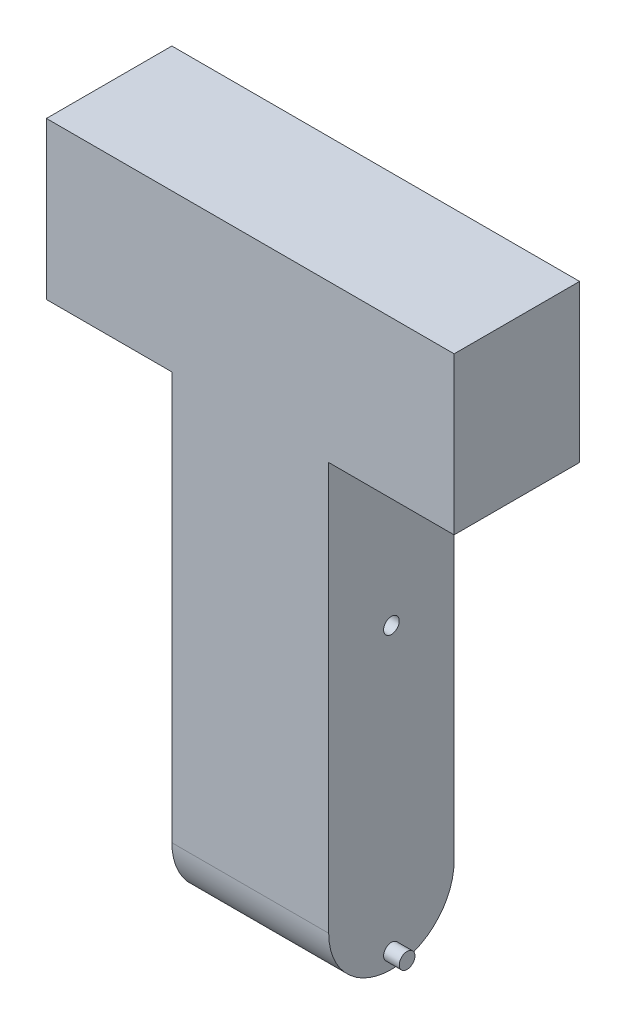
ISO-10303-21;
HEADER;
FILE_DESCRIPTION(('STEP AP214'),'2;1');
FILE_NAME('part.step','',(''),(''),'','','');
FILE_SCHEMA(('AUTOMOTIVE_DESIGN { 1 0 10303 214 1 1 1 1 }'));
ENDSEC;
DATA;
#1=APPLICATION_CONTEXT('core data for automotive mechanical design processes');
#2=APPLICATION_PROTOCOL_DEFINITION('international standard','automotive_design',2000,#1);
#3=PRODUCT_CONTEXT('',#1,'mechanical');
#4=PRODUCT('Part','Part','',(#3));
#5=PRODUCT_RELATED_PRODUCT_CATEGORY('part','',(#4));
#6=PRODUCT_DEFINITION_FORMATION('','',#4);
#7=PRODUCT_DEFINITION_CONTEXT('part definition',#1,'design');
#8=PRODUCT_DEFINITION('design','',#6,#7);
#9=PRODUCT_DEFINITION_SHAPE('','',#8);
#10=(LENGTH_UNIT() NAMED_UNIT(*) SI_UNIT(.MILLI.,.METRE.));
#11=(NAMED_UNIT(*) PLANE_ANGLE_UNIT() SI_UNIT($,.RADIAN.));
#12=(NAMED_UNIT(*) SI_UNIT($,.STERADIAN.) SOLID_ANGLE_UNIT());
#13=UNCERTAINTY_MEASURE_WITH_UNIT(LENGTH_MEASURE(1.E-05),#10,'distance_accuracy_value','');
#14=(GEOMETRIC_REPRESENTATION_CONTEXT(3) GLOBAL_UNCERTAINTY_ASSIGNED_CONTEXT((#13)) GLOBAL_UNIT_ASSIGNED_CONTEXT((#10,
#11,#12)) REPRESENTATION_CONTEXT('',''));
#15=CARTESIAN_POINT('',(0.,0.,0.));
#16=DIRECTION('',(0.,0.,1.));
#17=DIRECTION('',(1.,0.,0.));
#18=AXIS2_PLACEMENT_3D('',#15,#16,#17);
#19=CARTESIAN_POINT('',(0.,0.,203.2));
#20=DIRECTION('',(1.,0.,0.));
#21=DIRECTION('',(0.,0.,-1.));
#22=AXIS2_PLACEMENT_3D('',#19,#20,#21);
#23=PLANE('',#22);
#24=CARTESIAN_POINT('',(0.,25.4,101.6));
#25=DIRECTION('',(1.,0.,0.));
#26=DIRECTION('',(0.,0.,-1.));
#27=AXIS2_PLACEMENT_3D('',#24,#25,#26);
#28=CIRCLE('',#27,12.7);
#29=CARTESIAN_POINT('',(0.,25.4,88.8999999999998));
#30=VERTEX_POINT('',#29);
#31=EDGE_CURVE('E164',#30,#30,#28,.T.);
#32=ORIENTED_EDGE('',*,*,#31,.T.);
#33=EDGE_LOOP('',(#32));
#34=FACE_BOUND('',#33,.T.);
#35=CARTESIAN_POINT('',(0.,482.6,101.6));
#36=DIRECTION('',(1.,0.,0.));
#37=DIRECTION('',(0.,0.,-1.));
#38=AXIS2_PLACEMENT_3D('',#35,#36,#37);
#39=CIRCLE('',#38,12.7);
#40=CARTESIAN_POINT('',(0.,482.6,88.8999999999999));
#41=VERTEX_POINT('',#40);
#42=EDGE_CURVE('E154',#41,#41,#39,.F.);
#43=ORIENTED_EDGE('',*,*,#42,.F.);
#44=EDGE_LOOP('',(#43));
#45=FACE_BOUND('',#44,.T.);
#46=DIRECTION('',(0.,0.,1.));
#47=VECTOR('',#46,1.);
#48=CARTESIAN_POINT('',(0.,762.,203.2));
#49=LINE('',#48,#47);
#50=CARTESIAN_POINT('',(0.,762.,0.));
#51=VERTEX_POINT('',#50);
#52=CARTESIAN_POINT('',(0.,762.,203.2));
#53=VERTEX_POINT('',#52);
#54=EDGE_CURVE('E152',#51,#53,#49,.T.);
#55=ORIENTED_EDGE('',*,*,#54,.F.);
#56=DIRECTION('',(0.,-1.,0.));
#57=VECTOR('',#56,1.);
#58=CARTESIAN_POINT('',(0.,0.,0.));
#59=LINE('',#58,#57);
#60=CARTESIAN_POINT('',(0.,101.6,0.));
#61=VERTEX_POINT('',#60);
#62=EDGE_CURVE('E167',#51,#61,#59,.T.);
#63=ORIENTED_EDGE('',*,*,#62,.T.);
#64=CARTESIAN_POINT('',(0.,101.6,101.6));
#65=DIRECTION('',(1.,0.,0.));
#66=DIRECTION('',(0.,0.,-1.));
#67=AXIS2_PLACEMENT_3D('',#64,#65,#66);
#68=CIRCLE('',#67,101.6);
#69=CARTESIAN_POINT('',(0.,101.6,203.2));
#70=VERTEX_POINT('',#69);
#71=EDGE_CURVE('E49',#61,#70,#68,.F.);
#72=ORIENTED_EDGE('',*,*,#71,.T.);
#73=DIRECTION('',(0.,-1.,0.));
#74=VECTOR('',#73,1.);
#75=CARTESIAN_POINT('',(0.,0.,203.2));
#76=LINE('',#75,#74);
#77=EDGE_CURVE('E65',#53,#70,#76,.T.);
#78=ORIENTED_EDGE('',*,*,#77,.F.);
#79=EDGE_LOOP('',(#55,#63,#72,#78));
#80=FACE_BOUND('',#79,.T.);
#81=ADVANCED_FACE('F39',(#34,#45,#80),#23,.F.);
#82=CARTESIAN_POINT('',(254.,0.,203.2));
#83=DIRECTION('',(-1.,0.,0.));
#84=DIRECTION('',(0.,0.,1.));
#85=AXIS2_PLACEMENT_3D('',#82,#83,#84);
#86=PLANE('',#85);
#87=CARTESIAN_POINT('',(254.,25.4,101.6));
#88=DIRECTION('',(-1.,0.,0.));
#89=DIRECTION('',(0.,0.,1.));
#90=AXIS2_PLACEMENT_3D('',#87,#88,#89);
#91=CIRCLE('',#90,12.7);
#92=CARTESIAN_POINT('',(254.,25.4,114.3));
#93=VERTEX_POINT('',#92);
#94=EDGE_CURVE('E163',#93,#93,#91,.T.);
#95=ORIENTED_EDGE('',*,*,#94,.T.);
#96=EDGE_LOOP('',(#95));
#97=FACE_BOUND('',#96,.T.);
#98=CARTESIAN_POINT('',(254.,482.6,101.6));
#99=DIRECTION('',(-1.,0.,0.));
#100=DIRECTION('',(0.,0.,1.));
#101=AXIS2_PLACEMENT_3D('',#98,#99,#100);
#102=CIRCLE('',#101,12.7);
#103=CARTESIAN_POINT('',(254.,482.6,114.3));
#104=VERTEX_POINT('',#103);
#105=EDGE_CURVE('E44',#104,#104,#102,.F.);
#106=ORIENTED_EDGE('',*,*,#105,.F.);
#107=EDGE_LOOP('',(#106));
#108=FACE_BOUND('',#107,.T.);
#109=DIRECTION('',(0.,0.,-1.));
#110=VECTOR('',#109,1.);
#111=CARTESIAN_POINT('',(254.,762.,203.2));
#112=LINE('',#111,#110);
#113=CARTESIAN_POINT('',(254.,762.,203.2));
#114=VERTEX_POINT('',#113);
#115=CARTESIAN_POINT('',(254.,762.,0.));
#116=VERTEX_POINT('',#115);
#117=EDGE_CURVE('E57',#114,#116,#112,.T.);
#118=ORIENTED_EDGE('',*,*,#117,.F.);
#119=DIRECTION('',(0.,1.,0.));
#120=VECTOR('',#119,1.);
#121=CARTESIAN_POINT('',(254.,0.,203.2));
#122=LINE('',#121,#120);
#123=CARTESIAN_POINT('',(254.,101.6,203.2));
#124=VERTEX_POINT('',#123);
#125=EDGE_CURVE('E169',#124,#114,#122,.T.);
#126=ORIENTED_EDGE('',*,*,#125,.F.);
#127=CARTESIAN_POINT('',(254.,101.6,101.6));
#128=DIRECTION('',(-1.,0.,0.));
#129=DIRECTION('',(0.,0.,1.));
#130=AXIS2_PLACEMENT_3D('',#127,#128,#129);
#131=CIRCLE('',#130,101.6);
#132=CARTESIAN_POINT('',(254.,101.6,0.));
#133=VERTEX_POINT('',#132);
#134=EDGE_CURVE('E12',#124,#133,#131,.F.);
#135=ORIENTED_EDGE('',*,*,#134,.T.);
#136=DIRECTION('',(0.,1.,0.));
#137=VECTOR('',#136,1.);
#138=CARTESIAN_POINT('',(254.,0.,0.));
#139=LINE('',#138,#137);
#140=EDGE_CURVE('E175',#133,#116,#139,.T.);
#141=ORIENTED_EDGE('',*,*,#140,.T.);
#142=EDGE_LOOP('',(#118,#126,#135,#141));
#143=FACE_BOUND('',#142,.T.);
#144=ADVANCED_FACE('F186',(#97,#108,#143),#86,.F.);
#145=CARTESIAN_POINT('',(0.,101.6,101.6));
#146=DIRECTION('',(1.,0.,0.));
#147=DIRECTION('',(0.,0.,-1.));
#148=AXIS2_PLACEMENT_3D('',#145,#146,#147);
#149=CYLINDRICAL_SURFACE('',#148,101.6);
#150=DIRECTION('',(1.,0.,0.));
#151=VECTOR('',#150,1.);
#152=CARTESIAN_POINT('',(0.,101.6,203.2));
#153=LINE('',#152,#151);
#154=EDGE_CURVE('E173',#70,#124,#153,.T.);
#155=ORIENTED_EDGE('',*,*,#154,.F.);
#156=ORIENTED_EDGE('',*,*,#71,.F.);
#157=DIRECTION('',(-1.,0.,0.));
#158=VECTOR('',#157,1.);
#159=CARTESIAN_POINT('',(0.,101.6,0.));
#160=LINE('',#159,#158);
#161=EDGE_CURVE('E180',#133,#61,#160,.T.);
#162=ORIENTED_EDGE('',*,*,#161,.F.);
#163=ORIENTED_EDGE('',*,*,#134,.F.);
#164=EDGE_LOOP('',(#155,#156,#162,#163));
#165=FACE_BOUND('',#164,.T.);
#166=ADVANCED_FACE('F42',(#165),#149,.T.);
#167=CARTESIAN_POINT('',(0.,1016.,203.2));
#168=DIRECTION('',(0.,-1.,0.));
#169=DIRECTION('',(0.,0.,-1.));
#170=AXIS2_PLACEMENT_3D('',#167,#168,#169);
#171=PLANE('',#170);
#172=DIRECTION('',(-1.,0.,0.));
#173=VECTOR('',#172,1.);
#174=CARTESIAN_POINT('',(0.,1016.,0.));
#175=LINE('',#174,#173);
#176=CARTESIAN_POINT('',(457.2,1016.,0.));
#177=VERTEX_POINT('',#176);
#178=CARTESIAN_POINT('',(-203.2,1016.,0.));
#179=VERTEX_POINT('',#178);
#180=EDGE_CURVE('E131',#177,#179,#175,.T.);
#181=ORIENTED_EDGE('',*,*,#180,.T.);
#182=DIRECTION('',(0.,0.,-1.));
#183=VECTOR('',#182,1.);
#184=CARTESIAN_POINT('',(-203.2,1016.,910.762124480953));
#185=LINE('',#184,#183);
#186=CARTESIAN_POINT('',(-203.2,1016.,203.2));
#187=VERTEX_POINT('',#186);
#188=EDGE_CURVE('E136',#187,#179,#185,.T.);
#189=ORIENTED_EDGE('',*,*,#188,.F.);
#190=DIRECTION('',(-1.,0.,0.));
#191=VECTOR('',#190,1.);
#192=CARTESIAN_POINT('',(0.,1016.,203.2));
#193=LINE('',#192,#191);
#194=CARTESIAN_POINT('',(457.2,1016.,203.2));
#195=VERTEX_POINT('',#194);
#196=EDGE_CURVE('E171',#195,#187,#193,.T.);
#197=ORIENTED_EDGE('',*,*,#196,.F.);
#198=DIRECTION('',(0.,0.,-1.));
#199=VECTOR('',#198,1.);
#200=CARTESIAN_POINT('',(457.2,1016.,910.762124480953));
#201=LINE('',#200,#199);
#202=EDGE_CURVE('E127',#195,#177,#201,.T.);
#203=ORIENTED_EDGE('',*,*,#202,.T.);
#204=EDGE_LOOP('',(#181,#189,#197,#203));
#205=FACE_BOUND('',#204,.T.);
#206=ADVANCED_FACE('F215',(#205),#171,.F.);
#207=CARTESIAN_POINT('',(0.,0.,203.2));
#208=DIRECTION('',(0.,0.,-1.));
#209=DIRECTION('',(-1.,0.,0.));
#210=AXIS2_PLACEMENT_3D('',#207,#208,#209);
#211=PLANE('',#210);
#212=ORIENTED_EDGE('',*,*,#196,.T.);
#213=DIRECTION('',(0.,1.,0.));
#214=VECTOR('',#213,1.);
#215=CARTESIAN_POINT('',(-203.2,1016.,203.2));
#216=LINE('',#215,#214);
#217=CARTESIAN_POINT('',(-203.2,762.,203.2));
#218=VERTEX_POINT('',#217);
#219=EDGE_CURVE('E144',#218,#187,#216,.T.);
#220=ORIENTED_EDGE('',*,*,#219,.F.);
#221=DIRECTION('',(-1.,0.,0.));
#222=VECTOR('',#221,1.);
#223=CARTESIAN_POINT('',(-203.2,762.,203.2));
#224=LINE('',#223,#222);
#225=EDGE_CURVE('E141',#53,#218,#224,.T.);
#226=ORIENTED_EDGE('',*,*,#225,.F.);
#227=ORIENTED_EDGE('',*,*,#77,.T.);
#228=ORIENTED_EDGE('',*,*,#154,.T.);
#229=ORIENTED_EDGE('',*,*,#125,.T.);
#230=CARTESIAN_POINT('',(457.2,762.,203.2));
#231=VERTEX_POINT('',#230);
#232=EDGE_CURVE('E142',#231,#114,#224,.T.);
#233=ORIENTED_EDGE('',*,*,#232,.F.);
#234=DIRECTION('',(0.,-1.,0.));
#235=VECTOR('',#234,1.);
#236=CARTESIAN_POINT('',(457.2,1016.,203.2));
#237=LINE('',#236,#235);
#238=EDGE_CURVE('E125',#195,#231,#237,.T.);
#239=ORIENTED_EDGE('',*,*,#238,.F.);
#240=EDGE_LOOP('',(#212,#220,#226,#227,#228,#229,#233,#239));
#241=FACE_BOUND('',#240,.T.);
#242=ADVANCED_FACE('F218',(#241),#211,.F.);
#243=CARTESIAN_POINT('',(0.,0.,0.));
#244=DIRECTION('',(0.,0.,-1.));
#245=DIRECTION('',(-1.,0.,0.));
#246=AXIS2_PLACEMENT_3D('',#243,#244,#245);
#247=PLANE('',#246);
#248=ORIENTED_EDGE('',*,*,#180,.F.);
#249=DIRECTION('',(0.,1.,0.));
#250=VECTOR('',#249,1.);
#251=CARTESIAN_POINT('',(457.2,1016.,0.));
#252=LINE('',#251,#250);
#253=CARTESIAN_POINT('',(457.2,762.,0.));
#254=VERTEX_POINT('',#253);
#255=EDGE_CURVE('E123',#254,#177,#252,.T.);
#256=ORIENTED_EDGE('',*,*,#255,.F.);
#257=DIRECTION('',(1.,0.,0.));
#258=VECTOR('',#257,1.);
#259=CARTESIAN_POINT('',(-203.2,762.,0.));
#260=LINE('',#259,#258);
#261=EDGE_CURVE('E108',#116,#254,#260,.T.);
#262=ORIENTED_EDGE('',*,*,#261,.F.);
#263=ORIENTED_EDGE('',*,*,#140,.F.);
#264=ORIENTED_EDGE('',*,*,#161,.T.);
#265=ORIENTED_EDGE('',*,*,#62,.F.);
#266=CARTESIAN_POINT('',(-203.2,762.,0.));
#267=VERTEX_POINT('',#266);
#268=EDGE_CURVE('E117',#267,#51,#260,.T.);
#269=ORIENTED_EDGE('',*,*,#268,.F.);
#270=DIRECTION('',(0.,-1.,0.));
#271=VECTOR('',#270,1.);
#272=CARTESIAN_POINT('',(-203.2,1016.,0.));
#273=LINE('',#272,#271);
#274=EDGE_CURVE('E133',#179,#267,#273,.T.);
#275=ORIENTED_EDGE('',*,*,#274,.F.);
#276=EDGE_LOOP('',(#248,#256,#262,#263,#264,#265,#269,#275));
#277=FACE_BOUND('',#276,.T.);
#278=ADVANCED_FACE('F129',(#277),#247,.T.);
#279=CARTESIAN_POINT('',(279.4,25.4,101.6));
#280=DIRECTION('',(1.,0.,0.));
#281=DIRECTION('',(0.,0.,-1.));
#282=AXIS2_PLACEMENT_3D('',#279,#280,#281);
#283=PLANE('',#282);
#284=CARTESIAN_POINT('',(279.4,25.4,101.6));
#285=DIRECTION('',(1.,0.,0.));
#286=DIRECTION('',(0.,0.,-1.));
#287=AXIS2_PLACEMENT_3D('',#284,#285,#286);
#288=CIRCLE('',#287,12.7);
#289=CARTESIAN_POINT('',(279.4,25.4,88.8999999999998));
#290=VERTEX_POINT('',#289);
#291=EDGE_CURVE('E157',#290,#290,#288,.T.);
#292=ORIENTED_EDGE('',*,*,#291,.T.);
#293=EDGE_LOOP('',(#292));
#294=FACE_BOUND('',#293,.T.);
#295=ADVANCED_FACE('F192',(#294),#283,.T.);
#296=CARTESIAN_POINT('',(-86.7210244842765,25.4,101.6));
#297=DIRECTION('',(1.,0.,0.));
#298=DIRECTION('',(0.,0.,-1.));
#299=AXIS2_PLACEMENT_3D('',#296,#297,#298);
#300=CYLINDRICAL_SURFACE('',#299,12.7);
#301=ORIENTED_EDGE('',*,*,#291,.F.);
#302=EDGE_LOOP('',(#301));
#303=FACE_BOUND('',#302,.T.);
#304=ORIENTED_EDGE('',*,*,#94,.F.);
#305=EDGE_LOOP('',(#304));
#306=FACE_BOUND('',#305,.T.);
#307=ADVANCED_FACE('F189',(#303,#306),#300,.T.);
#308=CARTESIAN_POINT('',(-25.4,25.4,101.6));
#309=DIRECTION('',(1.,0.,0.));
#310=DIRECTION('',(0.,0.,-1.));
#311=AXIS2_PLACEMENT_3D('',#308,#309,#310);
#312=CIRCLE('',#311,12.7);
#313=CARTESIAN_POINT('',(-25.4,25.4,88.8999999999998));
#314=VERTEX_POINT('',#313);
#315=EDGE_CURVE('E160',#314,#314,#312,.F.);
#316=ORIENTED_EDGE('',*,*,#315,.F.);
#317=EDGE_LOOP('',(#316));
#318=FACE_BOUND('',#317,.T.);
#319=ORIENTED_EDGE('',*,*,#31,.F.);
#320=EDGE_LOOP('',(#319));
#321=FACE_BOUND('',#320,.T.);
#322=ADVANCED_FACE('F191',(#318,#321),#300,.T.);
#323=CARTESIAN_POINT('',(-25.4,0.,203.2));
#324=DIRECTION('',(1.,0.,0.));
#325=DIRECTION('',(0.,0.,-1.));
#326=AXIS2_PLACEMENT_3D('',#323,#324,#325);
#327=PLANE('',#326);
#328=ORIENTED_EDGE('',*,*,#315,.T.);
#329=EDGE_LOOP('',(#328));
#330=FACE_BOUND('',#329,.T.);
#331=ADVANCED_FACE('F199',(#330),#327,.F.);
#332=CARTESIAN_POINT('',(449.834,482.6,101.6));
#333=DIRECTION('',(-1.,0.,0.));
#334=DIRECTION('',(0.,0.,1.));
#335=AXIS2_PLACEMENT_3D('',#332,#333,#334);
#336=CYLINDRICAL_SURFACE('',#335,12.7);
#337=ORIENTED_EDGE('',*,*,#105,.T.);
#338=EDGE_LOOP('',(#337));
#339=FACE_BOUND('',#338,.T.);
#340=ORIENTED_EDGE('',*,*,#42,.T.);
#341=EDGE_LOOP('',(#340));
#342=FACE_BOUND('',#341,.T.);
#343=ADVANCED_FACE('F263',(#339,#342),#336,.F.);
#344=CARTESIAN_POINT('',(457.2,1016.,910.762124480953));
#345=DIRECTION('',(-1.,0.,0.));
#346=DIRECTION('',(0.,-1.,0.));
#347=AXIS2_PLACEMENT_3D('',#344,#345,#346);
#348=PLANE('',#347);
#349=ORIENTED_EDGE('',*,*,#202,.F.);
#350=ORIENTED_EDGE('',*,*,#238,.T.);
#351=DIRECTION('',(0.,0.,-1.));
#352=VECTOR('',#351,1.);
#353=CARTESIAN_POINT('',(457.2,762.,910.762124480953));
#354=LINE('',#353,#352);
#355=EDGE_CURVE('E112',#231,#254,#354,.T.);
#356=ORIENTED_EDGE('',*,*,#355,.T.);
#357=ORIENTED_EDGE('',*,*,#255,.T.);
#358=EDGE_LOOP('',(#349,#350,#356,#357));
#359=FACE_BOUND('',#358,.T.);
#360=ADVANCED_FACE('F122',(#359),#348,.F.);
#361=CARTESIAN_POINT('',(-203.2,762.,910.762124480953));
#362=DIRECTION('',(0.,1.,0.));
#363=DIRECTION('',(0.,0.,1.));
#364=AXIS2_PLACEMENT_3D('',#361,#362,#363);
#365=PLANE('',#364);
#366=ORIENTED_EDGE('',*,*,#232,.T.);
#367=ORIENTED_EDGE('',*,*,#117,.T.);
#368=ORIENTED_EDGE('',*,*,#261,.T.);
#369=ORIENTED_EDGE('',*,*,#355,.F.);
#370=EDGE_LOOP('',(#366,#367,#368,#369));
#371=FACE_BOUND('',#370,.T.);
#372=ADVANCED_FACE('F111',(#371),#365,.F.);
#373=ORIENTED_EDGE('',*,*,#268,.T.);
#374=ORIENTED_EDGE('',*,*,#54,.T.);
#375=ORIENTED_EDGE('',*,*,#225,.T.);
#376=DIRECTION('',(0.,0.,-1.));
#377=VECTOR('',#376,1.);
#378=CARTESIAN_POINT('',(-203.2,762.,910.762124480953));
#379=LINE('',#378,#377);
#380=EDGE_CURVE('E126',#218,#267,#379,.T.);
#381=ORIENTED_EDGE('',*,*,#380,.T.);
#382=EDGE_LOOP('',(#373,#374,#375,#381));
#383=FACE_BOUND('',#382,.T.);
#384=ADVANCED_FACE('F233',(#383),#365,.F.);
#385=CARTESIAN_POINT('',(-203.2,1016.,910.762124480953));
#386=DIRECTION('',(1.,0.,0.));
#387=DIRECTION('',(0.,1.,0.));
#388=AXIS2_PLACEMENT_3D('',#385,#386,#387);
#389=PLANE('',#388);
#390=ORIENTED_EDGE('',*,*,#380,.F.);
#391=ORIENTED_EDGE('',*,*,#219,.T.);
#392=ORIENTED_EDGE('',*,*,#188,.T.);
#393=ORIENTED_EDGE('',*,*,#274,.T.);
#394=EDGE_LOOP('',(#390,#391,#392,#393));
#395=FACE_BOUND('',#394,.T.);
#396=ADVANCED_FACE('F230',(#395),#389,.F.);
#397=CLOSED_SHELL('',(#81,#144,#166,#206,#242,#278,#295,#307,#322,#331,#343,#360,#372,#384,#396));
#398=MANIFOLD_SOLID_BREP('B2',#397);
#399=ADVANCED_BREP_SHAPE_REPRESENTATION('',(#18,#398),#14);
#400=SHAPE_DEFINITION_REPRESENTATION(#9,#399);
ENDSEC;
END-ISO-10303-21;
